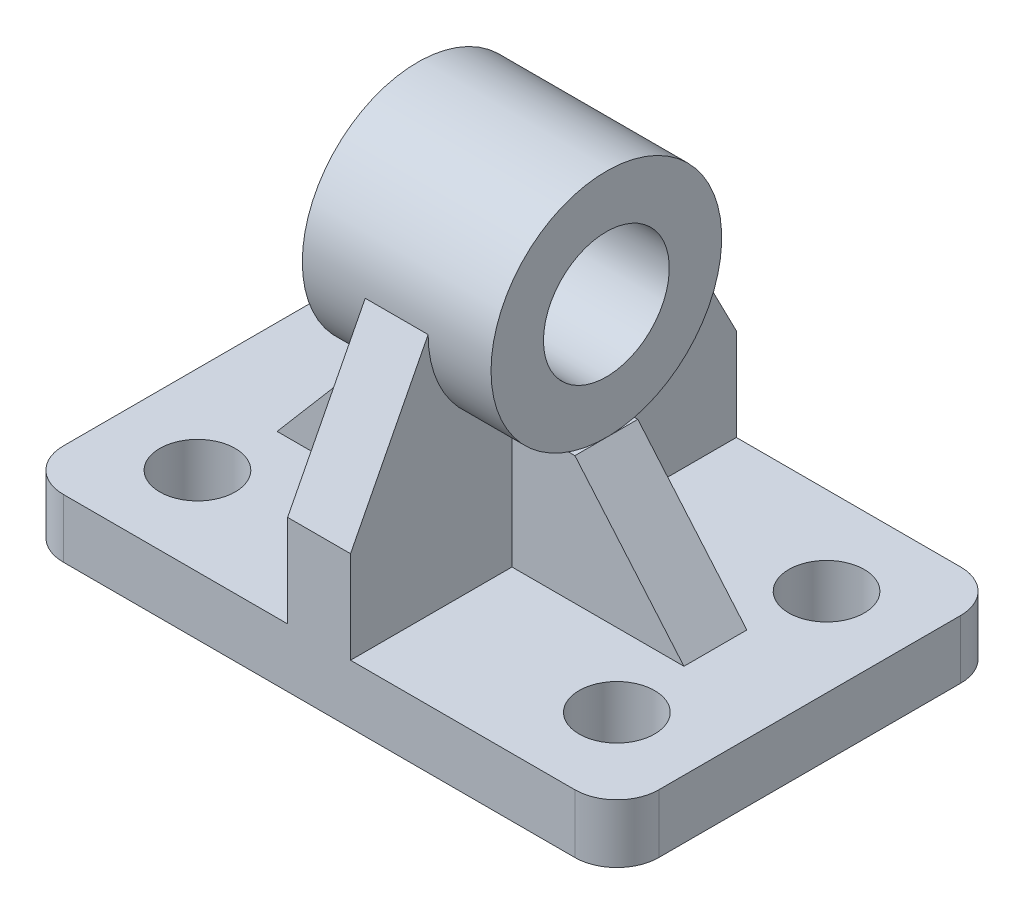
ISO-10303-21;
HEADER;
FILE_DESCRIPTION(('STEP AP214'),'2;1');
FILE_NAME('part.step','',(''),(''),'','','');
FILE_SCHEMA(('AUTOMOTIVE_DESIGN { 1 0 10303 214 1 1 1 1 }'));
ENDSEC;
DATA;
#1=APPLICATION_CONTEXT('core data for automotive mechanical design processes');
#2=APPLICATION_PROTOCOL_DEFINITION('international standard','automotive_design',2000,#1);
#3=PRODUCT_CONTEXT('',#1,'mechanical');
#4=PRODUCT('Part','Part','',(#3));
#5=PRODUCT_RELATED_PRODUCT_CATEGORY('part','',(#4));
#6=PRODUCT_DEFINITION_FORMATION('','',#4);
#7=PRODUCT_DEFINITION_CONTEXT('part definition',#1,'design');
#8=PRODUCT_DEFINITION('design','',#6,#7);
#9=PRODUCT_DEFINITION_SHAPE('','',#8);
#10=(LENGTH_UNIT() NAMED_UNIT(*) SI_UNIT(.MILLI.,.METRE.));
#11=(NAMED_UNIT(*) PLANE_ANGLE_UNIT() SI_UNIT($,.RADIAN.));
#12=(NAMED_UNIT(*) SI_UNIT($,.STERADIAN.) SOLID_ANGLE_UNIT());
#13=UNCERTAINTY_MEASURE_WITH_UNIT(LENGTH_MEASURE(1.E-05),#10,'distance_accuracy_value','');
#14=(GEOMETRIC_REPRESENTATION_CONTEXT(3) GLOBAL_UNCERTAINTY_ASSIGNED_CONTEXT((#13)) GLOBAL_UNIT_ASSIGNED_CONTEXT((#10,
#11,#12)) REPRESENTATION_CONTEXT('',''));
#15=CARTESIAN_POINT('',(0.,0.,0.));
#16=DIRECTION('',(0.,0.,1.));
#17=DIRECTION('',(1.,0.,0.));
#18=AXIS2_PLACEMENT_3D('',#15,#16,#17);
#19=CARTESIAN_POINT('',(22.5,72.,0.));
#20=DIRECTION('',(-1.,0.,0.));
#21=DIRECTION('',(0.,0.,1.));
#22=AXIS2_PLACEMENT_3D('',#19,#20,#21);
#23=CYLINDRICAL_SURFACE('',#22,15.);
#24=CARTESIAN_POINT('',(22.5,72.,0.));
#25=DIRECTION('',(1.,0.,0.));
#26=DIRECTION('',(0.,0.,-1.));
#27=AXIS2_PLACEMENT_3D('',#24,#25,#26);
#28=CIRCLE('',#27,15.);
#29=CARTESIAN_POINT('',(22.5,72.,15.));
#30=VERTEX_POINT('',#29);
#31=EDGE_CURVE('E70',#30,#30,#28,.T.);
#32=CARTESIAN_POINT('',(-22.5,72.,0.));
#33=DIRECTION('',(1.,0.,0.));
#34=DIRECTION('',(0.,0.,-1.));
#35=AXIS2_PLACEMENT_3D('',#32,#33,#34);
#36=CIRCLE('',#35,15.);
#37=CARTESIAN_POINT('',(-22.5,72.,15.));
#38=VERTEX_POINT('',#37);
#39=EDGE_CURVE('E76',#38,#38,#36,.T.);
#40=CARTESIAN_POINT('',(22.5,72.,15.));
#41=CARTESIAN_POINT('',(22.03125,72.,15.));
#42=CARTESIAN_POINT('',(21.5625,72.,15.));
#43=CARTESIAN_POINT('',(20.625,72.,15.));
#44=CARTESIAN_POINT('',(20.15625,72.,15.));
#45=CARTESIAN_POINT('',(19.21875,72.,15.));
#46=CARTESIAN_POINT('',(18.75,72.,15.));
#47=CARTESIAN_POINT('',(17.8125,72.,15.));
#48=CARTESIAN_POINT('',(17.34375,72.,15.));
#49=CARTESIAN_POINT('',(16.40625,72.,15.));
#50=CARTESIAN_POINT('',(15.9375,72.,15.));
#51=CARTESIAN_POINT('',(15.,72.,15.));
#52=CARTESIAN_POINT('',(14.53125,72.,15.));
#53=CARTESIAN_POINT('',(13.59375,72.,15.));
#54=CARTESIAN_POINT('',(13.125,72.,15.));
#55=CARTESIAN_POINT('',(12.1875,72.,15.));
#56=CARTESIAN_POINT('',(11.71875,72.,15.));
#57=CARTESIAN_POINT('',(10.78125,72.,15.));
#58=CARTESIAN_POINT('',(10.3125,72.,15.));
#59=CARTESIAN_POINT('',(9.37499999999999,72.,15.));
#60=CARTESIAN_POINT('',(8.90625,72.,15.));
#61=CARTESIAN_POINT('',(7.96874999999999,72.,15.));
#62=CARTESIAN_POINT('',(7.5,72.,15.));
#63=CARTESIAN_POINT('',(6.5625,72.,15.));
#64=CARTESIAN_POINT('',(6.09375,72.,15.));
#65=CARTESIAN_POINT('',(5.15625,72.,15.));
#66=CARTESIAN_POINT('',(4.6875,72.,15.));
#67=CARTESIAN_POINT('',(3.75,72.,15.));
#68=CARTESIAN_POINT('',(3.28125,72.,15.));
#69=CARTESIAN_POINT('',(2.34375,72.,15.));
#70=CARTESIAN_POINT('',(1.875,72.,15.));
#71=CARTESIAN_POINT('',(0.937499999999997,72.,15.));
#72=CARTESIAN_POINT('',(0.468749999999997,72.,15.));
#73=CARTESIAN_POINT('',(-0.468750000000004,72.,15.));
#74=CARTESIAN_POINT('',(-0.937500000000004,72.,15.));
#75=CARTESIAN_POINT('',(-1.87500000000001,72.,15.));
#76=CARTESIAN_POINT('',(-2.34375000000001,72.,15.));
#77=CARTESIAN_POINT('',(-3.28125,72.,15.));
#78=CARTESIAN_POINT('',(-3.75,72.,15.));
#79=CARTESIAN_POINT('',(-4.6875,72.,15.));
#80=CARTESIAN_POINT('',(-5.15625,72.,15.));
#81=CARTESIAN_POINT('',(-6.09375000000001,72.,15.));
#82=CARTESIAN_POINT('',(-6.56250000000001,72.,15.));
#83=CARTESIAN_POINT('',(-7.50000000000001,72.,15.));
#84=CARTESIAN_POINT('',(-7.96875000000001,72.,15.));
#85=CARTESIAN_POINT('',(-8.90625,72.,15.));
#86=CARTESIAN_POINT('',(-9.37500000000001,72.,15.));
#87=CARTESIAN_POINT('',(-10.3125,72.,15.));
#88=CARTESIAN_POINT('',(-10.78125,72.,15.));
#89=CARTESIAN_POINT('',(-11.71875,72.,15.));
#90=CARTESIAN_POINT('',(-12.1875,72.,15.));
#91=CARTESIAN_POINT('',(-13.125,72.,15.));
#92=CARTESIAN_POINT('',(-13.59375,72.,15.));
#93=CARTESIAN_POINT('',(-14.53125,72.,15.));
#94=CARTESIAN_POINT('',(-15.,72.,15.));
#95=CARTESIAN_POINT('',(-15.9375,72.,15.));
#96=CARTESIAN_POINT('',(-16.40625,72.,15.));
#97=CARTESIAN_POINT('',(-17.34375,72.,15.));
#98=CARTESIAN_POINT('',(-17.8125,72.,15.));
#99=CARTESIAN_POINT('',(-18.75,72.,15.));
#100=CARTESIAN_POINT('',(-19.21875,72.,15.));
#101=CARTESIAN_POINT('',(-20.15625,72.,15.));
#102=CARTESIAN_POINT('',(-20.625,72.,15.));
#103=CARTESIAN_POINT('',(-21.5625,72.,15.));
#104=CARTESIAN_POINT('',(-22.03125,72.,15.));
#105=CARTESIAN_POINT('',(-22.5,72.,15.));
#106=B_SPLINE_CURVE_WITH_KNOTS('',3,(#40,#41,#42,#43,#44,#45,#46,#47,#48,#49,#50,#51,#52,#53,
#54,#55,#56,#57,#58,#59,#60,#61,#62,#63,#64,#65,#66,#67,#68,#69,#70,#71,#72,#73,#74,#75,#76,#77,
#78,#79,#80,#81,#82,#83,#84,#85,#86,#87,#88,#89,#90,#91,#92,#93,#94,#95,#96,#97,#98,#99,#100,
#101,#102,#103,#104,#105),.UNSPECIFIED.,.F.,.F.,(4,2,2,2,2,2,2,2,2,2,2,2,2,2,2,2,2,2,2,2,2,2,2,
2,2,2,2,2,2,2,2,2,4),(0.,1.40625,2.8125,4.21875,5.625,7.03125,8.4375,9.84375,11.25,12.65625,
14.0625,15.46875,16.875,18.28125,19.6875,21.09375,22.5,23.90625,25.3125,26.71875,28.125,
29.53125,30.9375,32.34375,33.75,35.15625,36.5625,37.96875,39.375,40.78125,42.1875,43.59375,45.),.UNSPECIFIED.);
#107=EDGE_CURVE('BSEAM63',#30,#38,#106,.T.);
#108=ORIENTED_EDGE('',*,*,#31,.T.);
#109=ORIENTED_EDGE('',*,*,#39,.F.);
#110=ORIENTED_EDGE('',*,*,#107,.T.);
#111=ORIENTED_EDGE('',*,*,#107,.F.);
#112=EDGE_LOOP('',(#108,#110,#109,#111));
#113=FACE_BOUND('',#112,.T.);
#114=ADVANCED_FACE('F63',(#113),#23,.F.);
#115=CARTESIAN_POINT('',(22.5,72.,0.));
#116=DIRECTION('',(-1.,0.,0.));
#117=DIRECTION('',(0.,0.,1.));
#118=AXIS2_PLACEMENT_3D('',#115,#116,#117);
#119=CYLINDRICAL_SURFACE('',#118,27.5);
#120=CARTESIAN_POINT('',(22.5,72.,0.));
#121=DIRECTION('',(1.,0.,0.));
#122=DIRECTION('',(0.,0.,-1.));
#123=AXIS2_PLACEMENT_3D('',#120,#121,#122);
#124=CIRCLE('',#123,27.5);
#125=CARTESIAN_POINT('',(22.5,72.,27.5));
#126=VERTEX_POINT('',#125);
#127=EDGE_CURVE('E12',#126,#126,#124,.T.);
#128=CARTESIAN_POINT('',(-22.5,72.,0.));
#129=DIRECTION('',(1.,0.,0.));
#130=DIRECTION('',(0.,0.,-1.));
#131=AXIS2_PLACEMENT_3D('',#128,#129,#130);
#132=CIRCLE('',#131,27.5);
#133=CARTESIAN_POINT('',(-22.5,72.,27.5));
#134=VERTEX_POINT('',#133);
#135=EDGE_CURVE('E66',#134,#134,#132,.T.);
#136=CARTESIAN_POINT('',(22.5,72.,27.5));
#137=CARTESIAN_POINT('',(22.03125,72.,27.5));
#138=CARTESIAN_POINT('',(21.5625,72.,27.5));
#139=CARTESIAN_POINT('',(20.625,72.,27.5));
#140=CARTESIAN_POINT('',(20.15625,72.,27.5));
#141=CARTESIAN_POINT('',(19.21875,72.,27.5));
#142=CARTESIAN_POINT('',(18.75,72.,27.5));
#143=CARTESIAN_POINT('',(17.8125,72.,27.5));
#144=CARTESIAN_POINT('',(17.34375,72.,27.5));
#145=CARTESIAN_POINT('',(16.40625,72.,27.5));
#146=CARTESIAN_POINT('',(15.9375,72.,27.5));
#147=CARTESIAN_POINT('',(15.,72.,27.5));
#148=CARTESIAN_POINT('',(14.53125,72.,27.5));
#149=CARTESIAN_POINT('',(13.59375,72.,27.5));
#150=CARTESIAN_POINT('',(13.125,72.,27.5));
#151=CARTESIAN_POINT('',(12.1875,72.,27.5));
#152=CARTESIAN_POINT('',(11.71875,72.,27.5));
#153=CARTESIAN_POINT('',(10.78125,72.,27.5));
#154=CARTESIAN_POINT('',(10.3125,72.,27.5));
#155=CARTESIAN_POINT('',(9.37499999999999,72.,27.5));
#156=CARTESIAN_POINT('',(8.90625,72.,27.5));
#157=CARTESIAN_POINT('',(7.96874999999999,72.,27.5));
#158=CARTESIAN_POINT('',(7.5,72.,27.5));
#159=CARTESIAN_POINT('',(6.5625,72.,27.5));
#160=CARTESIAN_POINT('',(6.09374999999999,72.,27.5));
#161=CARTESIAN_POINT('',(5.15624999999999,72.,27.5));
#162=CARTESIAN_POINT('',(4.68749999999999,72.,27.5));
#163=CARTESIAN_POINT('',(3.74999999999999,72.,27.5));
#164=CARTESIAN_POINT('',(3.28124999999999,72.,27.5));
#165=CARTESIAN_POINT('',(2.34375,72.,27.5));
#166=CARTESIAN_POINT('',(1.87499999999999,72.,27.5));
#167=CARTESIAN_POINT('',(0.937499999999994,72.,27.5));
#168=CARTESIAN_POINT('',(0.468749999999993,72.,27.5));
#169=CARTESIAN_POINT('',(-0.468750000000007,72.,27.5));
#170=CARTESIAN_POINT('',(-0.937500000000008,72.,27.5));
#171=CARTESIAN_POINT('',(-1.87500000000001,72.,27.5));
#172=CARTESIAN_POINT('',(-2.34375000000001,72.,27.5));
#173=CARTESIAN_POINT('',(-3.28125000000001,72.,27.5));
#174=CARTESIAN_POINT('',(-3.75000000000001,72.,27.5));
#175=CARTESIAN_POINT('',(-4.68750000000001,72.,27.5));
#176=CARTESIAN_POINT('',(-5.15625000000001,72.,27.5));
#177=CARTESIAN_POINT('',(-6.09375000000001,72.,27.5));
#178=CARTESIAN_POINT('',(-6.56250000000001,72.,27.5));
#179=CARTESIAN_POINT('',(-7.50000000000001,72.,27.5));
#180=CARTESIAN_POINT('',(-7.96875000000001,72.,27.5));
#181=CARTESIAN_POINT('',(-8.90625000000001,72.,27.5));
#182=CARTESIAN_POINT('',(-9.37500000000001,72.,27.5));
#183=CARTESIAN_POINT('',(-10.3125,72.,27.5));
#184=CARTESIAN_POINT('',(-10.78125,72.,27.5));
#185=CARTESIAN_POINT('',(-11.71875,72.,27.5));
#186=CARTESIAN_POINT('',(-12.1875,72.,27.5));
#187=CARTESIAN_POINT('',(-13.125,72.,27.5));
#188=CARTESIAN_POINT('',(-13.59375,72.,27.5));
#189=CARTESIAN_POINT('',(-14.53125,72.,27.5));
#190=CARTESIAN_POINT('',(-15.,72.,27.5));
#191=CARTESIAN_POINT('',(-15.9375,72.,27.5));
#192=CARTESIAN_POINT('',(-16.40625,72.,27.5));
#193=CARTESIAN_POINT('',(-17.34375,72.,27.5));
#194=CARTESIAN_POINT('',(-17.8125,72.,27.5));
#195=CARTESIAN_POINT('',(-18.75,72.,27.5));
#196=CARTESIAN_POINT('',(-19.21875,72.,27.5));
#197=CARTESIAN_POINT('',(-20.15625,72.,27.5));
#198=CARTESIAN_POINT('',(-20.625,72.,27.5));
#199=CARTESIAN_POINT('',(-21.5625,72.,27.5));
#200=CARTESIAN_POINT('',(-22.03125,72.,27.5));
#201=CARTESIAN_POINT('',(-22.5,72.,27.5));
#202=B_SPLINE_CURVE_WITH_KNOTS('',3,(#136,#137,#138,#139,#140,#141,#142,#143,#144,#145,#146,
#147,#148,#149,#150,#151,#152,#153,#154,#155,#156,#157,#158,#159,#160,#161,#162,#163,#164,#165,
#166,#167,#168,#169,#170,#171,#172,#173,#174,#175,#176,#177,#178,#179,#180,#181,#182,#183,#184,
#185,#186,#187,#188,#189,#190,#191,#192,#193,#194,#195,#196,#197,#198,#199,#200,#201),
.UNSPECIFIED.,.F.,.F.,(4,2,2,2,2,2,2,2,2,2,2,2,2,2,2,2,2,2,2,2,2,2,2,2,2,2,2,2,2,2,2,2,4),(0.,
1.40625,2.8125,4.21875,5.625,7.03125,8.4375,9.84375,11.25,12.65625,14.0625,15.46875,16.875,
18.28125,19.6875,21.09375,22.5,23.90625,25.3125,26.71875,28.125,29.53125,30.9375,32.34375,33.75,
35.15625,36.5625,37.96875,39.375,40.78125,42.1875,43.59375,45.),.UNSPECIFIED.);
#203=EDGE_CURVE('BSEAM83',#126,#134,#202,.T.);
#204=ORIENTED_EDGE('',*,*,#127,.F.);
#205=ORIENTED_EDGE('',*,*,#135,.T.);
#206=ORIENTED_EDGE('',*,*,#203,.T.);
#207=ORIENTED_EDGE('',*,*,#203,.F.);
#208=EDGE_LOOP('',(#204,#206,#205,#207));
#209=FACE_BOUND('',#208,.T.);
#210=ADVANCED_FACE('F83',(#209),#119,.T.);
#211=CARTESIAN_POINT('',(22.5,0.,0.));
#212=DIRECTION('',(1.,0.,0.));
#213=DIRECTION('',(0.,0.,-1.));
#214=AXIS2_PLACEMENT_3D('',#211,#212,#213);
#215=PLANE('',#214);
#216=ORIENTED_EDGE('',*,*,#31,.F.);
#217=EDGE_LOOP('',(#216));
#218=FACE_BOUND('',#217,.T.);
#219=ORIENTED_EDGE('',*,*,#127,.T.);
#220=EDGE_LOOP('',(#219));
#221=FACE_BOUND('',#220,.T.);
#222=ADVANCED_FACE('F87',(#218,#221),#215,.T.);
#223=CARTESIAN_POINT('',(-22.5,0.,0.));
#224=DIRECTION('',(1.,0.,0.));
#225=DIRECTION('',(0.,0.,-1.));
#226=AXIS2_PLACEMENT_3D('',#223,#224,#225);
#227=PLANE('',#226);
#228=ORIENTED_EDGE('',*,*,#39,.T.);
#229=EDGE_LOOP('',(#228));
#230=FACE_BOUND('',#229,.T.);
#231=ORIENTED_EDGE('',*,*,#135,.F.);
#232=EDGE_LOOP('',(#231));
#233=FACE_BOUND('',#232,.T.);
#234=ADVANCED_FACE('F85',(#230,#233),#227,.F.);
#235=CLOSED_SHELL('',(#114,#210,#222,#234));
#236=MANIFOLD_SOLID_BREP('B2',#235);
#237=CARTESIAN_POINT('',(0.,44.5,0.));
#238=DIRECTION('',(0.,1.,0.));
#239=DIRECTION('',(0.,0.,1.));
#240=AXIS2_PLACEMENT_3D('',#237,#238,#239);
#241=PLANE('',#240);
#242=DIRECTION('',(-1.,0.,0.));
#243=VECTOR('',#242,1.);
#244=CARTESIAN_POINT('',(0.,44.5,7.5));
#245=LINE('',#244,#243);
#246=CARTESIAN_POINT('',(-7.5,44.5,7.5));
#247=VERTEX_POINT('',#246);
#248=CARTESIAN_POINT('',(-22.5,44.5,7.5));
#249=VERTEX_POINT('',#248);
#250=EDGE_CURVE('E371',#247,#249,#245,.T.);
#251=ORIENTED_EDGE('',*,*,#250,.F.);
#252=DIRECTION('',(0.,0.,-1.));
#253=VECTOR('',#252,1.);
#254=CARTESIAN_POINT('',(-7.5,44.5,0.));
#255=LINE('',#254,#253);
#256=CARTESIAN_POINT('',(-7.5,44.5,0.));
#257=VERTEX_POINT('',#256);
#258=EDGE_CURVE('E157',#247,#257,#255,.T.);
#259=ORIENTED_EDGE('',*,*,#258,.T.);
#260=CARTESIAN_POINT('',(-7.5,44.5,-7.5));
#261=VERTEX_POINT('',#260);
#262=EDGE_CURVE('E304',#257,#261,#255,.T.);
#263=ORIENTED_EDGE('',*,*,#262,.T.);
#264=DIRECTION('',(-1.,0.,0.));
#265=VECTOR('',#264,1.);
#266=CARTESIAN_POINT('',(0.,44.5,-7.5));
#267=LINE('',#266,#265);
#268=CARTESIAN_POINT('',(-22.5,44.5,-7.5));
#269=VERTEX_POINT('',#268);
#270=EDGE_CURVE('E359',#261,#269,#267,.T.);
#271=ORIENTED_EDGE('',*,*,#270,.T.);
#272=DIRECTION('',(0.,0.,1.));
#273=VECTOR('',#272,1.);
#274=CARTESIAN_POINT('',(-22.5,44.5,-46.001));
#275=LINE('',#274,#273);
#276=EDGE_CURVE('E355',#269,#249,#275,.T.);
#277=ORIENTED_EDGE('',*,*,#276,.T.);
#278=EDGE_LOOP('',(#251,#259,#263,#271,#277));
#279=FACE_BOUND('',#278,.T.);
#280=ADVANCED_FACE('F133',(#279),#241,.T.);
#281=CARTESIAN_POINT('',(0.,44.5,7.5));
#282=DIRECTION('',(0.,0.,1.));
#283=DIRECTION('',(1.,0.,0.));
#284=AXIS2_PLACEMENT_3D('',#281,#282,#283);
#285=PLANE('',#284);
#286=DIRECTION('',(0.,-1.,0.));
#287=VECTOR('',#286,1.);
#288=CARTESIAN_POINT('',(-7.5,36.,7.5));
#289=LINE('',#288,#287);
#290=CARTESIAN_POINT('',(-7.5,14.,7.5));
#291=VERTEX_POINT('',#290);
#292=EDGE_CURVE('E487',#247,#291,#289,.T.);
#293=ORIENTED_EDGE('',*,*,#292,.F.);
#294=ORIENTED_EDGE('',*,*,#250,.T.);
#295=DIRECTION('',(0.648734176013878,0.761015091093203,0.));
#296=VECTOR('',#295,1.);
#297=CARTESIAN_POINT('',(-22.5,44.5,7.5));
#298=LINE('',#297,#296);
#299=CARTESIAN_POINT('',(-48.5,14.,7.5));
#300=VERTEX_POINT('',#299);
#301=EDGE_CURVE('E350',#300,#249,#298,.T.);
#302=ORIENTED_EDGE('',*,*,#301,.F.);
#303=DIRECTION('',(-1.,0.,0.));
#304=VECTOR('',#303,1.);
#305=CARTESIAN_POINT('',(0.,14.,7.5));
#306=LINE('',#305,#304);
#307=EDGE_CURVE('E511',#291,#300,#306,.T.);
#308=ORIENTED_EDGE('',*,*,#307,.F.);
#309=EDGE_LOOP('',(#293,#294,#302,#308));
#310=FACE_BOUND('',#309,.T.);
#311=ADVANCED_FACE('F628',(#310),#285,.T.);
#312=CARTESIAN_POINT('',(0.,44.5,-7.5));
#313=DIRECTION('',(0.,0.,1.));
#314=DIRECTION('',(1.,0.,0.));
#315=AXIS2_PLACEMENT_3D('',#312,#313,#314);
#316=PLANE('',#315);
#317=ORIENTED_EDGE('',*,*,#270,.F.);
#318=DIRECTION('',(0.,-1.,0.));
#319=VECTOR('',#318,1.);
#320=CARTESIAN_POINT('',(-7.5,36.,-7.5));
#321=LINE('',#320,#319);
#322=CARTESIAN_POINT('',(-7.5,14.,-7.5));
#323=VERTEX_POINT('',#322);
#324=EDGE_CURVE('E387',#261,#323,#321,.T.);
#325=ORIENTED_EDGE('',*,*,#324,.T.);
#326=DIRECTION('',(-1.,0.,0.));
#327=VECTOR('',#326,1.);
#328=CARTESIAN_POINT('',(0.,14.,-7.5));
#329=LINE('',#328,#327);
#330=CARTESIAN_POINT('',(-48.5,14.,-7.50000000000001));
#331=VERTEX_POINT('',#330);
#332=EDGE_CURVE('E518',#323,#331,#329,.T.);
#333=ORIENTED_EDGE('',*,*,#332,.T.);
#334=DIRECTION('',(-0.648734176013878,-0.761015091093203,0.));
#335=VECTOR('',#334,1.);
#336=CARTESIAN_POINT('',(-22.5,44.5,-7.5));
#337=LINE('',#336,#335);
#338=EDGE_CURVE('E347',#269,#331,#337,.T.);
#339=ORIENTED_EDGE('',*,*,#338,.F.);
#340=EDGE_LOOP('',(#317,#325,#333,#339));
#341=FACE_BOUND('',#340,.T.);
#342=ADVANCED_FACE('F639',(#341),#316,.F.);
#343=CARTESIAN_POINT('',(-61.,14.,36.));
#344=DIRECTION('',(0.,-1.,0.));
#345=DIRECTION('',(0.,0.,-1.));
#346=AXIS2_PLACEMENT_3D('',#343,#344,#345);
#347=CYLINDRICAL_SURFACE('',#346,10.);
#348=CARTESIAN_POINT('',(-61.,0.,36.));
#349=DIRECTION('',(0.,1.,0.));
#350=DIRECTION('',(0.,0.,1.));
#351=AXIS2_PLACEMENT_3D('',#348,#349,#350);
#352=CIRCLE('',#351,10.);
#353=CARTESIAN_POINT('',(-61.,0.,46.));
#354=VERTEX_POINT('',#353);
#355=CARTESIAN_POINT('',(-71.,0.,36.));
#356=VERTEX_POINT('',#355);
#357=EDGE_CURVE('E543',#354,#356,#352,.F.);
#358=ORIENTED_EDGE('',*,*,#357,.F.);
#359=DIRECTION('',(0.,-1.,0.));
#360=VECTOR('',#359,1.);
#361=CARTESIAN_POINT('',(-61.,14.,46.));
#362=LINE('',#361,#360);
#363=CARTESIAN_POINT('',(-61.,14.,46.));
#364=VERTEX_POINT('',#363);
#365=EDGE_CURVE('E61',#364,#354,#362,.T.);
#366=ORIENTED_EDGE('',*,*,#365,.F.);
#367=CARTESIAN_POINT('',(-61.,14.,36.));
#368=DIRECTION('',(0.,1.,0.));
#369=DIRECTION('',(0.,0.,1.));
#370=AXIS2_PLACEMENT_3D('',#367,#368,#369);
#371=CIRCLE('',#370,10.);
#372=CARTESIAN_POINT('',(-71.,14.,36.));
#373=VERTEX_POINT('',#372);
#374=EDGE_CURVE('E500',#364,#373,#371,.F.);
#375=ORIENTED_EDGE('',*,*,#374,.T.);
#376=DIRECTION('',(0.,-1.,0.));
#377=VECTOR('',#376,1.);
#378=CARTESIAN_POINT('',(-71.,14.,36.));
#379=LINE('',#378,#377);
#380=EDGE_CURVE('E535',#373,#356,#379,.T.);
#381=ORIENTED_EDGE('',*,*,#380,.T.);
#382=EDGE_LOOP('',(#358,#366,#375,#381));
#383=FACE_BOUND('',#382,.T.);
#384=ADVANCED_FACE('F621',(#383),#347,.T.);
#385=CARTESIAN_POINT('',(0.,14.,46.));
#386=DIRECTION('',(0.,0.,1.));
#387=DIRECTION('',(1.,0.,0.));
#388=AXIS2_PLACEMENT_3D('',#385,#386,#387);
#389=PLANE('',#388);
#390=DIRECTION('',(-1.,0.,0.));
#391=VECTOR('',#390,1.);
#392=CARTESIAN_POINT('',(0.,0.,46.));
#393=LINE('',#392,#391);
#394=CARTESIAN_POINT('',(61.0000000000002,0.,46.));
#395=VERTEX_POINT('',#394);
#396=EDGE_CURVE('E547',#395,#354,#393,.T.);
#397=ORIENTED_EDGE('',*,*,#396,.F.);
#398=DIRECTION('',(0.,-1.,0.));
#399=VECTOR('',#398,1.);
#400=CARTESIAN_POINT('',(61.0000000000002,14.,46.));
#401=LINE('',#400,#399);
#402=CARTESIAN_POINT('',(61.0000000000002,14.,46.));
#403=VERTEX_POINT('',#402);
#404=EDGE_CURVE('E442',#403,#395,#401,.T.);
#405=ORIENTED_EDGE('',*,*,#404,.F.);
#406=DIRECTION('',(-1.,0.,0.));
#407=VECTOR('',#406,1.);
#408=CARTESIAN_POINT('',(0.,14.,46.));
#409=LINE('',#408,#407);
#410=CARTESIAN_POINT('',(7.50000000000001,14.,46.));
#411=VERTEX_POINT('',#410);
#412=EDGE_CURVE('E434',#403,#411,#409,.T.);
#413=ORIENTED_EDGE('',*,*,#412,.T.);
#414=DIRECTION('',(0.,-1.,0.));
#415=VECTOR('',#414,1.);
#416=CARTESIAN_POINT('',(7.50000000000001,36.,46.));
#417=LINE('',#416,#415);
#418=CARTESIAN_POINT('',(7.50000000000001,36.,46.));
#419=VERTEX_POINT('',#418);
#420=EDGE_CURVE('E480',#419,#411,#417,.T.);
#421=ORIENTED_EDGE('',*,*,#420,.F.);
#422=DIRECTION('',(-1.,0.,0.));
#423=VECTOR('',#422,1.);
#424=CARTESIAN_POINT('',(0.,36.,46.));
#425=LINE('',#424,#423);
#426=CARTESIAN_POINT('',(-7.5,36.,46.));
#427=VERTEX_POINT('',#426);
#428=EDGE_CURVE('E312',#419,#427,#425,.T.);
#429=ORIENTED_EDGE('',*,*,#428,.T.);
#430=DIRECTION('',(0.,-1.,0.));
#431=VECTOR('',#430,1.);
#432=CARTESIAN_POINT('',(-7.5,36.,46.));
#433=LINE('',#432,#431);
#434=CARTESIAN_POINT('',(-7.5,14.,46.));
#435=VERTEX_POINT('',#434);
#436=EDGE_CURVE('E483',#427,#435,#433,.T.);
#437=ORIENTED_EDGE('',*,*,#436,.T.);
#438=DIRECTION('',(-1.,0.,0.));
#439=VECTOR('',#438,1.);
#440=CARTESIAN_POINT('',(0.,14.,46.));
#441=LINE('',#440,#439);
#442=EDGE_CURVE('E504',#435,#364,#441,.T.);
#443=ORIENTED_EDGE('',*,*,#442,.T.);
#444=ORIENTED_EDGE('',*,*,#365,.T.);
#445=EDGE_LOOP('',(#397,#405,#413,#421,#429,#437,#443,#444));
#446=FACE_BOUND('',#445,.T.);
#447=ADVANCED_FACE('F618',(#446),#389,.T.);
#448=CARTESIAN_POINT('',(0.,14.,-46.));
#449=DIRECTION('',(0.,0.,1.));
#450=DIRECTION('',(1.,0.,0.));
#451=AXIS2_PLACEMENT_3D('',#448,#449,#450);
#452=PLANE('',#451);
#453=DIRECTION('',(-1.,0.,0.));
#454=VECTOR('',#453,1.);
#455=CARTESIAN_POINT('',(0.,0.,-46.));
#456=LINE('',#455,#454);
#457=CARTESIAN_POINT('',(61.,0.,-46.));
#458=VERTEX_POINT('',#457);
#459=CARTESIAN_POINT('',(-61.,0.,-46.));
#460=VERTEX_POINT('',#459);
#461=EDGE_CURVE('E551',#458,#460,#456,.T.);
#462=ORIENTED_EDGE('',*,*,#461,.T.);
#463=DIRECTION('',(0.,-1.,0.));
#464=VECTOR('',#463,1.);
#465=CARTESIAN_POINT('',(-61.,14.,-46.));
#466=LINE('',#465,#464);
#467=CARTESIAN_POINT('',(-61.,14.,-46.));
#468=VERTEX_POINT('',#467);
#469=EDGE_CURVE('E142',#468,#460,#466,.T.);
#470=ORIENTED_EDGE('',*,*,#469,.F.);
#471=DIRECTION('',(-1.,0.,0.));
#472=VECTOR('',#471,1.);
#473=CARTESIAN_POINT('',(0.,14.,-46.));
#474=LINE('',#473,#472);
#475=CARTESIAN_POINT('',(-7.5,14.,-46.));
#476=VERTEX_POINT('',#475);
#477=EDGE_CURVE('E525',#476,#468,#474,.T.);
#478=ORIENTED_EDGE('',*,*,#477,.F.);
#479=DIRECTION('',(0.,-1.,0.));
#480=VECTOR('',#479,1.);
#481=CARTESIAN_POINT('',(-7.5,36.,-46.));
#482=LINE('',#481,#480);
#483=CARTESIAN_POINT('',(-7.5,36.,-46.));
#484=VERTEX_POINT('',#483);
#485=EDGE_CURVE('E391',#484,#476,#482,.T.);
#486=ORIENTED_EDGE('',*,*,#485,.F.);
#487=DIRECTION('',(-1.,0.,0.));
#488=VECTOR('',#487,1.);
#489=CARTESIAN_POINT('',(0.,36.,-46.));
#490=LINE('',#489,#488);
#491=CARTESIAN_POINT('',(7.5,36.,-46.));
#492=VERTEX_POINT('',#491);
#493=EDGE_CURVE('E376',#492,#484,#490,.T.);
#494=ORIENTED_EDGE('',*,*,#493,.F.);
#495=DIRECTION('',(0.,-1.,0.));
#496=VECTOR('',#495,1.);
#497=CARTESIAN_POINT('',(7.5,36.,-46.));
#498=LINE('',#497,#496);
#499=CARTESIAN_POINT('',(7.5,14.,-46.));
#500=VERTEX_POINT('',#499);
#501=EDGE_CURVE('E380',#492,#500,#498,.T.);
#502=ORIENTED_EDGE('',*,*,#501,.T.);
#503=DIRECTION('',(-1.,0.,0.));
#504=VECTOR('',#503,1.);
#505=CARTESIAN_POINT('',(0.,14.,-46.));
#506=LINE('',#505,#504);
#507=CARTESIAN_POINT('',(61.,14.,-46.));
#508=VERTEX_POINT('',#507);
#509=EDGE_CURVE('E412',#508,#500,#506,.T.);
#510=ORIENTED_EDGE('',*,*,#509,.F.);
#511=DIRECTION('',(0.,-1.,0.));
#512=VECTOR('',#511,1.);
#513=CARTESIAN_POINT('',(61.,14.,-46.));
#514=LINE('',#513,#512);
#515=EDGE_CURVE('E464',#508,#458,#514,.T.);
#516=ORIENTED_EDGE('',*,*,#515,.T.);
#517=EDGE_LOOP('',(#462,#470,#478,#486,#494,#502,#510,#516));
#518=FACE_BOUND('',#517,.T.);
#519=ADVANCED_FACE('F574',(#518),#452,.F.);
#520=CARTESIAN_POINT('',(-61.,14.,-36.));
#521=DIRECTION('',(0.,-1.,0.));
#522=DIRECTION('',(0.,0.,-1.));
#523=AXIS2_PLACEMENT_3D('',#520,#521,#522);
#524=CYLINDRICAL_SURFACE('',#523,10.);
#525=CARTESIAN_POINT('',(-61.,0.,-36.));
#526=DIRECTION('',(0.,1.,0.));
#527=DIRECTION('',(0.,0.,1.));
#528=AXIS2_PLACEMENT_3D('',#525,#526,#527);
#529=CIRCLE('',#528,10.);
#530=CARTESIAN_POINT('',(-71.,0.,-36.));
#531=VERTEX_POINT('',#530);
#532=EDGE_CURVE('E555',#531,#460,#529,.F.);
#533=ORIENTED_EDGE('',*,*,#532,.F.);
#534=DIRECTION('',(0.,-1.,0.));
#535=VECTOR('',#534,1.);
#536=CARTESIAN_POINT('',(-71.,14.,-36.));
#537=LINE('',#536,#535);
#538=CARTESIAN_POINT('',(-71.,14.,-36.));
#539=VERTEX_POINT('',#538);
#540=EDGE_CURVE('E564',#539,#531,#537,.T.);
#541=ORIENTED_EDGE('',*,*,#540,.F.);
#542=CARTESIAN_POINT('',(-61.,14.,-36.));
#543=DIRECTION('',(0.,1.,0.));
#544=DIRECTION('',(0.,0.,1.));
#545=AXIS2_PLACEMENT_3D('',#542,#543,#544);
#546=CIRCLE('',#545,10.);
#547=EDGE_CURVE('E528',#539,#468,#546,.F.);
#548=ORIENTED_EDGE('',*,*,#547,.T.);
#549=ORIENTED_EDGE('',*,*,#469,.T.);
#550=EDGE_LOOP('',(#533,#541,#548,#549));
#551=FACE_BOUND('',#550,.T.);
#552=ADVANCED_FACE('F570',(#551),#524,.T.);
#553=CARTESIAN_POINT('',(-50.,14.,-25.));
#554=DIRECTION('',(0.,-1.,0.));
#555=DIRECTION('',(0.,0.,-1.));
#556=AXIS2_PLACEMENT_3D('',#553,#554,#555);
#557=CYLINDRICAL_SURFACE('',#556,9.);
#558=CARTESIAN_POINT('',(-50.,14.,-25.));
#559=DIRECTION('',(0.,1.,0.));
#560=DIRECTION('',(0.,0.,1.));
#561=AXIS2_PLACEMENT_3D('',#558,#559,#560);
#562=CIRCLE('',#561,9.);
#563=CARTESIAN_POINT('',(-50.,14.,-16.));
#564=VERTEX_POINT('',#563);
#565=EDGE_CURVE('E495',#564,#564,#562,.T.);
#566=ORIENTED_EDGE('',*,*,#565,.T.);
#567=EDGE_LOOP('',(#566));
#568=FACE_BOUND('',#567,.T.);
#569=CARTESIAN_POINT('',(-50.,0.,-25.));
#570=DIRECTION('',(0.,1.,0.));
#571=DIRECTION('',(0.,0.,1.));
#572=AXIS2_PLACEMENT_3D('',#569,#570,#571);
#573=CIRCLE('',#572,9.);
#574=CARTESIAN_POINT('',(-50.,0.,-16.));
#575=VERTEX_POINT('',#574);
#576=EDGE_CURVE('E539',#575,#575,#573,.T.);
#577=ORIENTED_EDGE('',*,*,#576,.F.);
#578=EDGE_LOOP('',(#577));
#579=FACE_BOUND('',#578,.T.);
#580=ADVANCED_FACE('F693',(#568,#579),#557,.F.);
#581=CARTESIAN_POINT('',(-50.,14.,25.));
#582=DIRECTION('',(0.,-1.,0.));
#583=DIRECTION('',(0.,0.,-1.));
#584=AXIS2_PLACEMENT_3D('',#581,#582,#583);
#585=CYLINDRICAL_SURFACE('',#584,9.);
#586=CARTESIAN_POINT('',(-50.,14.,25.));
#587=DIRECTION('',(0.,1.,0.));
#588=DIRECTION('',(0.,0.,1.));
#589=AXIS2_PLACEMENT_3D('',#586,#587,#588);
#590=CIRCLE('',#589,9.);
#591=CARTESIAN_POINT('',(-50.,14.,34.));
#592=VERTEX_POINT('',#591);
#593=EDGE_CURVE('E491',#592,#592,#590,.T.);
#594=ORIENTED_EDGE('',*,*,#593,.T.);
#595=EDGE_LOOP('',(#594));
#596=FACE_BOUND('',#595,.T.);
#597=CARTESIAN_POINT('',(-50.,0.,25.));
#598=DIRECTION('',(0.,1.,0.));
#599=DIRECTION('',(0.,0.,1.));
#600=AXIS2_PLACEMENT_3D('',#597,#598,#599);
#601=CIRCLE('',#600,9.);
#602=CARTESIAN_POINT('',(-50.,0.,34.));
#603=VERTEX_POINT('',#602);
#604=EDGE_CURVE('E490',#603,#603,#601,.T.);
#605=ORIENTED_EDGE('',*,*,#604,.F.);
#606=EDGE_LOOP('',(#605));
#607=FACE_BOUND('',#606,.T.);
#608=ADVANCED_FACE('F135',(#596,#607),#585,.F.);
#609=CARTESIAN_POINT('',(-71.,14.,0.));
#610=DIRECTION('',(1.,0.,0.));
#611=DIRECTION('',(0.,0.,-1.));
#612=AXIS2_PLACEMENT_3D('',#609,#610,#611);
#613=PLANE('',#612);
#614=DIRECTION('',(0.,0.,1.));
#615=VECTOR('',#614,1.);
#616=CARTESIAN_POINT('',(-71.,0.,0.));
#617=LINE('',#616,#615);
#618=EDGE_CURVE('E496',#531,#356,#617,.T.);
#619=ORIENTED_EDGE('',*,*,#618,.T.);
#620=ORIENTED_EDGE('',*,*,#380,.F.);
#621=DIRECTION('',(0.,0.,1.));
#622=VECTOR('',#621,1.);
#623=CARTESIAN_POINT('',(-71.,14.,0.));
#624=LINE('',#623,#622);
#625=EDGE_CURVE('E532',#539,#373,#624,.T.);
#626=ORIENTED_EDGE('',*,*,#625,.F.);
#627=ORIENTED_EDGE('',*,*,#540,.T.);
#628=EDGE_LOOP('',(#619,#620,#626,#627));
#629=FACE_BOUND('',#628,.T.);
#630=ADVANCED_FACE('F584',(#629),#613,.F.);
#631=CARTESIAN_POINT('',(0.,14.,0.));
#632=DIRECTION('',(0.,1.,0.));
#633=DIRECTION('',(0.,0.,1.));
#634=AXIS2_PLACEMENT_3D('',#631,#632,#633);
#635=PLANE('',#634);
#636=ORIENTED_EDGE('',*,*,#593,.F.);
#637=EDGE_LOOP('',(#636));
#638=FACE_BOUND('',#637,.T.);
#639=ORIENTED_EDGE('',*,*,#565,.F.);
#640=EDGE_LOOP('',(#639));
#641=FACE_BOUND('',#640,.T.);
#642=ORIENTED_EDGE('',*,*,#374,.F.);
#643=ORIENTED_EDGE('',*,*,#442,.F.);
#644=DIRECTION('',(0.,0.,1.));
#645=VECTOR('',#644,1.);
#646=CARTESIAN_POINT('',(-7.5,14.,0.));
#647=LINE('',#646,#645);
#648=EDGE_CURVE('E508',#291,#435,#647,.T.);
#649=ORIENTED_EDGE('',*,*,#648,.F.);
#650=ORIENTED_EDGE('',*,*,#307,.T.);
#651=DIRECTION('',(0.,0.,1.));
#652=VECTOR('',#651,1.);
#653=CARTESIAN_POINT('',(-48.5,14.,0.));
#654=LINE('',#653,#652);
#655=EDGE_CURVE('E515',#331,#300,#654,.T.);
#656=ORIENTED_EDGE('',*,*,#655,.F.);
#657=ORIENTED_EDGE('',*,*,#332,.F.);
#658=DIRECTION('',(0.,0.,1.));
#659=VECTOR('',#658,1.);
#660=CARTESIAN_POINT('',(-7.5,14.,0.));
#661=LINE('',#660,#659);
#662=EDGE_CURVE('E522',#476,#323,#661,.T.);
#663=ORIENTED_EDGE('',*,*,#662,.F.);
#664=ORIENTED_EDGE('',*,*,#477,.T.);
#665=ORIENTED_EDGE('',*,*,#547,.F.);
#666=ORIENTED_EDGE('',*,*,#625,.T.);
#667=EDGE_LOOP('',(#642,#643,#649,#650,#656,#657,#663,#664,#665,#666));
#668=FACE_BOUND('',#667,.T.);
#669=ADVANCED_FACE('F588',(#638,#641,#668),#635,.T.);
#670=CARTESIAN_POINT('',(0.,0.,0.));
#671=DIRECTION('',(0.,1.,0.));
#672=DIRECTION('',(0.,0.,1.));
#673=AXIS2_PLACEMENT_3D('',#670,#671,#672);
#674=PLANE('',#673);
#675=ORIENTED_EDGE('',*,*,#604,.T.);
#676=EDGE_LOOP('',(#675));
#677=FACE_BOUND('',#676,.T.);
#678=ORIENTED_EDGE('',*,*,#576,.T.);
#679=EDGE_LOOP('',(#678));
#680=FACE_BOUND('',#679,.T.);
#681=ORIENTED_EDGE('',*,*,#357,.T.);
#682=ORIENTED_EDGE('',*,*,#618,.F.);
#683=ORIENTED_EDGE('',*,*,#532,.T.);
#684=ORIENTED_EDGE('',*,*,#461,.F.);
#685=CARTESIAN_POINT('',(61.,0.,-36.));
#686=DIRECTION('',(0.,1.,0.));
#687=DIRECTION('',(0.,0.,1.));
#688=AXIS2_PLACEMENT_3D('',#685,#686,#687);
#689=CIRCLE('',#688,9.99999999999999);
#690=CARTESIAN_POINT('',(71.,0.,-36.));
#691=VERTEX_POINT('',#690);
#692=EDGE_CURVE('E454',#691,#458,#689,.T.);
#693=ORIENTED_EDGE('',*,*,#692,.F.);
#694=DIRECTION('',(0.,0.,1.));
#695=VECTOR('',#694,1.);
#696=CARTESIAN_POINT('',(71.,0.,0.));
#697=LINE('',#696,#695);
#698=CARTESIAN_POINT('',(71.,0.,36.));
#699=VERTEX_POINT('',#698);
#700=EDGE_CURVE('E450',#691,#699,#697,.T.);
#701=ORIENTED_EDGE('',*,*,#700,.T.);
#702=CARTESIAN_POINT('',(61.,0.,36.));
#703=DIRECTION('',(0.,1.,0.));
#704=DIRECTION('',(0.,0.,1.));
#705=AXIS2_PLACEMENT_3D('',#702,#703,#704);
#706=CIRCLE('',#705,10.);
#707=EDGE_CURVE('E446',#699,#395,#706,.F.);
#708=ORIENTED_EDGE('',*,*,#707,.T.);
#709=ORIENTED_EDGE('',*,*,#396,.T.);
#710=EDGE_LOOP('',(#681,#682,#683,#684,#693,#701,#708,#709));
#711=FACE_BOUND('',#710,.T.);
#712=CARTESIAN_POINT('',(50.,0.,25.));
#713=DIRECTION('',(0.,1.,0.));
#714=DIRECTION('',(0.,0.,1.));
#715=AXIS2_PLACEMENT_3D('',#712,#713,#714);
#716=CIRCLE('',#715,9.);
#717=CARTESIAN_POINT('',(50.,0.,34.));
#718=VERTEX_POINT('',#717);
#719=EDGE_CURVE('E394',#718,#718,#716,.F.);
#720=ORIENTED_EDGE('',*,*,#719,.F.);
#721=EDGE_LOOP('',(#720));
#722=FACE_BOUND('',#721,.T.);
#723=CARTESIAN_POINT('',(50.,0.,-25.));
#724=DIRECTION('',(0.,1.,0.));
#725=DIRECTION('',(0.,0.,1.));
#726=AXIS2_PLACEMENT_3D('',#723,#724,#725);
#727=CIRCLE('',#726,9.);
#728=CARTESIAN_POINT('',(50.,0.,-16.));
#729=VERTEX_POINT('',#728);
#730=EDGE_CURVE('E400',#729,#729,#727,.F.);
#731=ORIENTED_EDGE('',*,*,#730,.F.);
#732=EDGE_LOOP('',(#731));
#733=FACE_BOUND('',#732,.T.);
#734=ADVANCED_FACE('F579',(#677,#680,#711,#722,#733),#674,.F.);
#735=CARTESIAN_POINT('',(-7.5,36.,0.));
#736=DIRECTION('',(1.,0.,0.));
#737=DIRECTION('',(0.,0.,-1.));
#738=AXIS2_PLACEMENT_3D('',#735,#736,#737);
#739=PLANE('',#738);
#740=ORIENTED_EDGE('',*,*,#648,.T.);
#741=ORIENTED_EDGE('',*,*,#436,.F.);
#742=DIRECTION('',(0.,-0.889431307788424,0.457068866502384));
#743=VECTOR('',#742,1.);
#744=CARTESIAN_POINT('',(-7.5,26.2212726995269,51.0251793071876));
#745=LINE('',#744,#743);
#746=CARTESIAN_POINT('',(-7.5,72.,27.5));
#747=VERTEX_POINT('',#746);
#748=EDGE_CURVE('E333',#747,#427,#745,.T.);
#749=ORIENTED_EDGE('',*,*,#748,.F.);
#750=CARTESIAN_POINT('',(-7.5,72.,0.));
#751=DIRECTION('',(1.,0.,0.));
#752=DIRECTION('',(0.,0.,-1.));
#753=AXIS2_PLACEMENT_3D('',#750,#751,#752);
#754=CIRCLE('',#753,27.5);
#755=EDGE_CURVE('E299',#747,#257,#754,.T.);
#756=ORIENTED_EDGE('',*,*,#755,.T.);
#757=ORIENTED_EDGE('',*,*,#258,.F.);
#758=ORIENTED_EDGE('',*,*,#292,.T.);
#759=EDGE_LOOP('',(#740,#741,#749,#756,#757,#758));
#760=FACE_BOUND('',#759,.T.);
#761=ADVANCED_FACE('F674',(#760),#739,.F.);
#762=CARTESIAN_POINT('',(7.5,36.,0.));
#763=DIRECTION('',(1.,0.,0.));
#764=DIRECTION('',(0.,0.,-1.));
#765=AXIS2_PLACEMENT_3D('',#762,#763,#764);
#766=PLANE('',#765);
#767=DIRECTION('',(0.,0.,1.));
#768=VECTOR('',#767,1.);
#769=CARTESIAN_POINT('',(7.5,14.,0.));
#770=LINE('',#769,#768);
#771=CARTESIAN_POINT('',(7.5,14.,7.5));
#772=VERTEX_POINT('',#771);
#773=EDGE_CURVE('E431',#772,#411,#770,.T.);
#774=ORIENTED_EDGE('',*,*,#773,.F.);
#775=DIRECTION('',(0.,-1.,0.));
#776=VECTOR('',#775,1.);
#777=CARTESIAN_POINT('',(7.5,36.,7.5));
#778=LINE('',#777,#776);
#779=CARTESIAN_POINT('',(7.5,44.5,7.5));
#780=VERTEX_POINT('',#779);
#781=EDGE_CURVE('E476',#780,#772,#778,.T.);
#782=ORIENTED_EDGE('',*,*,#781,.F.);
#783=DIRECTION('',(0.,0.,-1.));
#784=VECTOR('',#783,1.);
#785=CARTESIAN_POINT('',(7.5,44.5,0.));
#786=LINE('',#785,#784);
#787=CARTESIAN_POINT('',(7.5,44.5,0.));
#788=VERTEX_POINT('',#787);
#789=EDGE_CURVE('E320',#780,#788,#786,.T.);
#790=ORIENTED_EDGE('',*,*,#789,.T.);
#791=CARTESIAN_POINT('',(7.5,72.,0.));
#792=DIRECTION('',(1.,0.,0.));
#793=DIRECTION('',(0.,0.,-1.));
#794=AXIS2_PLACEMENT_3D('',#791,#792,#793);
#795=CIRCLE('',#794,27.5);
#796=CARTESIAN_POINT('',(7.5,72.,27.5));
#797=VERTEX_POINT('',#796);
#798=EDGE_CURVE('E296',#797,#788,#795,.T.);
#799=ORIENTED_EDGE('',*,*,#798,.F.);
#800=DIRECTION('',(0.,-0.889431307788424,0.457068866502384));
#801=VECTOR('',#800,1.);
#802=CARTESIAN_POINT('',(7.5,26.2212726995269,51.0251793071876));
#803=LINE('',#802,#801);
#804=EDGE_CURVE('E309',#797,#419,#803,.T.);
#805=ORIENTED_EDGE('',*,*,#804,.T.);
#806=ORIENTED_EDGE('',*,*,#420,.T.);
#807=EDGE_LOOP('',(#774,#782,#790,#799,#805,#806));
#808=FACE_BOUND('',#807,.T.);
#809=ADVANCED_FACE('F319',(#808),#766,.T.);
#810=CARTESIAN_POINT('',(61.,14.,36.));
#811=DIRECTION('',(0.,-1.,0.));
#812=DIRECTION('',(0.,0.,-1.));
#813=AXIS2_PLACEMENT_3D('',#810,#811,#812);
#814=CYLINDRICAL_SURFACE('',#813,10.);
#815=ORIENTED_EDGE('',*,*,#707,.F.);
#816=DIRECTION('',(0.,-1.,0.));
#817=VECTOR('',#816,1.);
#818=CARTESIAN_POINT('',(71.,14.,36.));
#819=LINE('',#818,#817);
#820=CARTESIAN_POINT('',(71.,14.,36.));
#821=VERTEX_POINT('',#820);
#822=EDGE_CURVE('E471',#821,#699,#819,.T.);
#823=ORIENTED_EDGE('',*,*,#822,.F.);
#824=CARTESIAN_POINT('',(61.,14.,36.));
#825=DIRECTION('',(0.,1.,0.));
#826=DIRECTION('',(0.,0.,1.));
#827=AXIS2_PLACEMENT_3D('',#824,#825,#826);
#828=CIRCLE('',#827,10.);
#829=EDGE_CURVE('E399',#821,#403,#828,.F.);
#830=ORIENTED_EDGE('',*,*,#829,.T.);
#831=ORIENTED_EDGE('',*,*,#404,.T.);
#832=EDGE_LOOP('',(#815,#823,#830,#831));
#833=FACE_BOUND('',#832,.T.);
#834=ADVANCED_FACE('F616',(#833),#814,.T.);
#835=CARTESIAN_POINT('',(71.,14.,0.));
#836=DIRECTION('',(1.,0.,0.));
#837=DIRECTION('',(0.,0.,-1.));
#838=AXIS2_PLACEMENT_3D('',#835,#836,#837);
#839=PLANE('',#838);
#840=ORIENTED_EDGE('',*,*,#700,.F.);
#841=DIRECTION('',(0.,-1.,0.));
#842=VECTOR('',#841,1.);
#843=CARTESIAN_POINT('',(71.,14.,-36.));
#844=LINE('',#843,#842);
#845=CARTESIAN_POINT('',(71.,14.,-36.));
#846=VERTEX_POINT('',#845);
#847=EDGE_CURVE('E468',#846,#691,#844,.T.);
#848=ORIENTED_EDGE('',*,*,#847,.F.);
#849=DIRECTION('',(0.,0.,1.));
#850=VECTOR('',#849,1.);
#851=CARTESIAN_POINT('',(71.,14.,0.));
#852=LINE('',#851,#850);
#853=EDGE_CURVE('E404',#846,#821,#852,.T.);
#854=ORIENTED_EDGE('',*,*,#853,.T.);
#855=ORIENTED_EDGE('',*,*,#822,.T.);
#856=EDGE_LOOP('',(#840,#848,#854,#855));
#857=FACE_BOUND('',#856,.T.);
#858=ADVANCED_FACE('F613',(#857),#839,.T.);
#859=CARTESIAN_POINT('',(61.,14.,-36.));
#860=DIRECTION('',(0.,-1.,0.));
#861=DIRECTION('',(0.,0.,-1.));
#862=AXIS2_PLACEMENT_3D('',#859,#860,#861);
#863=CYLINDRICAL_SURFACE('',#862,9.99999999999999);
#864=ORIENTED_EDGE('',*,*,#692,.T.);
#865=ORIENTED_EDGE('',*,*,#515,.F.);
#866=CARTESIAN_POINT('',(61.,14.,-36.));
#867=DIRECTION('',(0.,1.,0.));
#868=DIRECTION('',(0.,0.,1.));
#869=AXIS2_PLACEMENT_3D('',#866,#867,#868);
#870=CIRCLE('',#869,9.99999999999999);
#871=EDGE_CURVE('E408',#846,#508,#870,.T.);
#872=ORIENTED_EDGE('',*,*,#871,.F.);
#873=ORIENTED_EDGE('',*,*,#847,.T.);
#874=EDGE_LOOP('',(#864,#865,#872,#873));
#875=FACE_BOUND('',#874,.T.);
#876=ADVANCED_FACE('F610',(#875),#863,.T.);
#877=CARTESIAN_POINT('',(50.,14.,25.));
#878=DIRECTION('',(0.,-1.,0.));
#879=DIRECTION('',(0.,0.,-1.));
#880=AXIS2_PLACEMENT_3D('',#877,#878,#879);
#881=CYLINDRICAL_SURFACE('',#880,9.);
#882=CARTESIAN_POINT('',(50.,14.,25.));
#883=DIRECTION('',(0.,1.,0.));
#884=DIRECTION('',(0.,0.,1.));
#885=AXIS2_PLACEMENT_3D('',#882,#883,#884);
#886=CIRCLE('',#885,9.);
#887=CARTESIAN_POINT('',(50.,14.,34.));
#888=VERTEX_POINT('',#887);
#889=EDGE_CURVE('E395',#888,#888,#886,.F.);
#890=ORIENTED_EDGE('',*,*,#889,.F.);
#891=EDGE_LOOP('',(#890));
#892=FACE_BOUND('',#891,.T.);
#893=ORIENTED_EDGE('',*,*,#719,.T.);
#894=EDGE_LOOP('',(#893));
#895=FACE_BOUND('',#894,.T.);
#896=ADVANCED_FACE('F740',(#892,#895),#881,.F.);
#897=CARTESIAN_POINT('',(50.,14.,-25.));
#898=DIRECTION('',(0.,-1.,0.));
#899=DIRECTION('',(0.,0.,-1.));
#900=AXIS2_PLACEMENT_3D('',#897,#898,#899);
#901=CYLINDRICAL_SURFACE('',#900,9.);
#902=CARTESIAN_POINT('',(50.,14.,-25.));
#903=DIRECTION('',(0.,1.,0.));
#904=DIRECTION('',(0.,0.,1.));
#905=AXIS2_PLACEMENT_3D('',#902,#903,#904);
#906=CIRCLE('',#905,9.);
#907=CARTESIAN_POINT('',(50.,14.,-16.));
#908=VERTEX_POINT('',#907);
#909=EDGE_CURVE('E438',#908,#908,#906,.F.);
#910=ORIENTED_EDGE('',*,*,#909,.F.);
#911=EDGE_LOOP('',(#910));
#912=FACE_BOUND('',#911,.T.);
#913=ORIENTED_EDGE('',*,*,#730,.T.);
#914=EDGE_LOOP('',(#913));
#915=FACE_BOUND('',#914,.T.);
#916=ADVANCED_FACE('F735',(#912,#915),#901,.F.);
#917=CARTESIAN_POINT('',(0.,14.,0.));
#918=DIRECTION('',(0.,1.,0.));
#919=DIRECTION('',(0.,0.,1.));
#920=AXIS2_PLACEMENT_3D('',#917,#918,#919);
#921=PLANE('',#920);
#922=ORIENTED_EDGE('',*,*,#889,.T.);
#923=EDGE_LOOP('',(#922));
#924=FACE_BOUND('',#923,.T.);
#925=ORIENTED_EDGE('',*,*,#829,.F.);
#926=ORIENTED_EDGE('',*,*,#853,.F.);
#927=ORIENTED_EDGE('',*,*,#871,.T.);
#928=ORIENTED_EDGE('',*,*,#509,.T.);
#929=DIRECTION('',(0.,0.,1.));
#930=VECTOR('',#929,1.);
#931=CARTESIAN_POINT('',(7.5,14.,0.));
#932=LINE('',#931,#930);
#933=CARTESIAN_POINT('',(7.5,14.,-7.5));
#934=VERTEX_POINT('',#933);
#935=EDGE_CURVE('E416',#500,#934,#932,.T.);
#936=ORIENTED_EDGE('',*,*,#935,.T.);
#937=DIRECTION('',(-1.,0.,0.));
#938=VECTOR('',#937,1.);
#939=CARTESIAN_POINT('',(0.,14.,-7.5));
#940=LINE('',#939,#938);
#941=CARTESIAN_POINT('',(48.5,14.,-7.5));
#942=VERTEX_POINT('',#941);
#943=EDGE_CURVE('E420',#942,#934,#940,.T.);
#944=ORIENTED_EDGE('',*,*,#943,.F.);
#945=DIRECTION('',(0.,0.,1.));
#946=VECTOR('',#945,1.);
#947=CARTESIAN_POINT('',(48.5,14.,0.));
#948=LINE('',#947,#946);
#949=CARTESIAN_POINT('',(48.5,14.,7.5));
#950=VERTEX_POINT('',#949);
#951=EDGE_CURVE('E424',#942,#950,#948,.T.);
#952=ORIENTED_EDGE('',*,*,#951,.T.);
#953=DIRECTION('',(-1.,0.,0.));
#954=VECTOR('',#953,1.);
#955=CARTESIAN_POINT('',(0.,14.,7.5));
#956=LINE('',#955,#954);
#957=EDGE_CURVE('E428',#950,#772,#956,.T.);
#958=ORIENTED_EDGE('',*,*,#957,.T.);
#959=ORIENTED_EDGE('',*,*,#773,.T.);
#960=ORIENTED_EDGE('',*,*,#412,.F.);
#961=EDGE_LOOP('',(#925,#926,#927,#928,#936,#944,#952,#958,#959,#960));
#962=FACE_BOUND('',#961,.T.);
#963=ORIENTED_EDGE('',*,*,#909,.T.);
#964=EDGE_LOOP('',(#963));
#965=FACE_BOUND('',#964,.T.);
#966=ADVANCED_FACE('F604',(#924,#962,#965),#921,.T.);
#967=CARTESIAN_POINT('',(-7.5,36.,0.));
#968=DIRECTION('',(1.,0.,0.));
#969=DIRECTION('',(0.,0.,-1.));
#970=AXIS2_PLACEMENT_3D('',#967,#968,#969);
#971=PLANE('',#970);
#972=ORIENTED_EDGE('',*,*,#662,.T.);
#973=ORIENTED_EDGE('',*,*,#324,.F.);
#974=ORIENTED_EDGE('',*,*,#262,.F.);
#975=CARTESIAN_POINT('',(-7.5,72.,-27.5));
#976=VERTEX_POINT('',#975);
#977=EDGE_CURVE('E334',#257,#976,#754,.T.);
#978=ORIENTED_EDGE('',*,*,#977,.T.);
#979=DIRECTION('',(0.,-0.889431307788424,-0.457068866502384));
#980=VECTOR('',#979,1.);
#981=CARTESIAN_POINT('',(-7.5,26.2212726995269,-51.0251793071875));
#982=LINE('',#981,#980);
#983=EDGE_CURVE('E326',#976,#484,#982,.T.);
#984=ORIENTED_EDGE('',*,*,#983,.T.);
#985=ORIENTED_EDGE('',*,*,#485,.T.);
#986=EDGE_LOOP('',(#972,#973,#974,#978,#984,#985));
#987=FACE_BOUND('',#986,.T.);
#988=ADVANCED_FACE('F598',(#987),#971,.F.);
#989=CARTESIAN_POINT('',(7.5,36.,0.));
#990=DIRECTION('',(1.,0.,0.));
#991=DIRECTION('',(0.,0.,-1.));
#992=AXIS2_PLACEMENT_3D('',#989,#990,#991);
#993=PLANE('',#992);
#994=DIRECTION('',(0.,-1.,0.));
#995=VECTOR('',#994,1.);
#996=CARTESIAN_POINT('',(7.5,36.,-7.5));
#997=LINE('',#996,#995);
#998=CARTESIAN_POINT('',(7.5,44.5,-7.5));
#999=VERTEX_POINT('',#998);
#1000=EDGE_CURVE('E384',#999,#934,#997,.T.);
#1001=ORIENTED_EDGE('',*,*,#1000,.T.);
#1002=ORIENTED_EDGE('',*,*,#935,.F.);
#1003=ORIENTED_EDGE('',*,*,#501,.F.);
#1004=DIRECTION('',(0.,-0.889431307788424,-0.457068866502384));
#1005=VECTOR('',#1004,1.);
#1006=CARTESIAN_POINT('',(7.5,26.2212726995269,-51.0251793071875));
#1007=LINE('',#1006,#1005);
#1008=CARTESIAN_POINT('',(7.5,72.,-27.5));
#1009=VERTEX_POINT('',#1008);
#1010=EDGE_CURVE('E316',#1009,#492,#1007,.T.);
#1011=ORIENTED_EDGE('',*,*,#1010,.F.);
#1012=EDGE_CURVE('E323',#788,#1009,#795,.T.);
#1013=ORIENTED_EDGE('',*,*,#1012,.F.);
#1014=EDGE_CURVE('E149',#788,#999,#786,.T.);
#1015=ORIENTED_EDGE('',*,*,#1014,.T.);
#1016=EDGE_LOOP('',(#1001,#1002,#1003,#1011,#1013,#1015));
#1017=FACE_BOUND('',#1016,.T.);
#1018=ADVANCED_FACE('F601',(#1017),#993,.T.);
#1019=ORIENTED_EDGE('',*,*,#789,.F.);
#1020=CARTESIAN_POINT('',(22.5,44.5,7.5));
#1021=VERTEX_POINT('',#1020);
#1022=EDGE_CURVE('E372',#1021,#780,#245,.T.);
#1023=ORIENTED_EDGE('',*,*,#1022,.F.);
#1024=DIRECTION('',(0.,0.,1.));
#1025=VECTOR('',#1024,1.);
#1026=CARTESIAN_POINT('',(22.5,44.5,-46.001));
#1027=LINE('',#1026,#1025);
#1028=CARTESIAN_POINT('',(22.5,44.5,-7.5));
#1029=VERTEX_POINT('',#1028);
#1030=EDGE_CURVE('E363',#1029,#1021,#1027,.T.);
#1031=ORIENTED_EDGE('',*,*,#1030,.F.);
#1032=EDGE_CURVE('E368',#1029,#999,#267,.T.);
#1033=ORIENTED_EDGE('',*,*,#1032,.T.);
#1034=ORIENTED_EDGE('',*,*,#1014,.F.);
#1035=EDGE_LOOP('',(#1019,#1023,#1031,#1033,#1034));
#1036=FACE_BOUND('',#1035,.T.);
#1037=ADVANCED_FACE('F656',(#1036),#241,.T.);
#1038=ORIENTED_EDGE('',*,*,#1022,.T.);
#1039=ORIENTED_EDGE('',*,*,#781,.T.);
#1040=ORIENTED_EDGE('',*,*,#957,.F.);
#1041=DIRECTION('',(0.648734176013878,-0.761015091093203,0.));
#1042=VECTOR('',#1041,1.);
#1043=CARTESIAN_POINT('',(22.5,44.5,7.5));
#1044=LINE('',#1043,#1042);
#1045=EDGE_CURVE('E360',#1021,#950,#1044,.T.);
#1046=ORIENTED_EDGE('',*,*,#1045,.F.);
#1047=EDGE_LOOP('',(#1038,#1039,#1040,#1046));
#1048=FACE_BOUND('',#1047,.T.);
#1049=ADVANCED_FACE('F649',(#1048),#285,.T.);
#1050=ORIENTED_EDGE('',*,*,#1000,.F.);
#1051=ORIENTED_EDGE('',*,*,#1032,.F.);
#1052=DIRECTION('',(-0.648734176013878,0.761015091093203,0.));
#1053=VECTOR('',#1052,1.);
#1054=CARTESIAN_POINT('',(22.5,44.5,-7.5));
#1055=LINE('',#1054,#1053);
#1056=EDGE_CURVE('E351',#942,#1029,#1055,.T.);
#1057=ORIENTED_EDGE('',*,*,#1056,.F.);
#1058=ORIENTED_EDGE('',*,*,#943,.T.);
#1059=EDGE_LOOP('',(#1050,#1051,#1057,#1058));
#1060=FACE_BOUND('',#1059,.T.);
#1061=ADVANCED_FACE('F642',(#1060),#316,.F.);
#1062=CARTESIAN_POINT('',(22.5,44.5,-46.001));
#1063=DIRECTION('',(-0.761015091093202,-0.648734176013877,0.));
#1064=DIRECTION('',(0.648734176013878,-0.761015091093203,0.));
#1065=AXIS2_PLACEMENT_3D('',#1062,#1063,#1064);
#1066=PLANE('',#1065);
#1067=ORIENTED_EDGE('',*,*,#1056,.T.);
#1068=ORIENTED_EDGE('',*,*,#1030,.T.);
#1069=ORIENTED_EDGE('',*,*,#1045,.T.);
#1070=ORIENTED_EDGE('',*,*,#951,.F.);
#1071=EDGE_LOOP('',(#1067,#1068,#1069,#1070));
#1072=FACE_BOUND('',#1071,.T.);
#1073=ADVANCED_FACE('F652',(#1072),#1066,.F.);
#1074=CARTESIAN_POINT('',(-22.5,44.5,-46.001));
#1075=DIRECTION('',(0.761015091093202,-0.648734176013878,0.));
#1076=DIRECTION('',(0.648734176013878,0.761015091093203,0.));
#1077=AXIS2_PLACEMENT_3D('',#1074,#1075,#1076);
#1078=PLANE('',#1077);
#1079=ORIENTED_EDGE('',*,*,#338,.T.);
#1080=ORIENTED_EDGE('',*,*,#655,.T.);
#1081=ORIENTED_EDGE('',*,*,#301,.T.);
#1082=ORIENTED_EDGE('',*,*,#276,.F.);
#1083=EDGE_LOOP('',(#1079,#1080,#1081,#1082));
#1084=FACE_BOUND('',#1083,.T.);
#1085=ADVANCED_FACE('F631',(#1084),#1078,.F.);
#1086=CARTESIAN_POINT('',(7.5,72.,0.));
#1087=DIRECTION('',(-1.,0.,0.));
#1088=DIRECTION('',(0.,0.,1.));
#1089=AXIS2_PLACEMENT_3D('',#1086,#1087,#1088);
#1090=CYLINDRICAL_SURFACE('',#1089,27.5);
#1091=ORIENTED_EDGE('',*,*,#798,.T.);
#1092=ORIENTED_EDGE('',*,*,#1012,.T.);
#1093=DIRECTION('',(-1.,0.,0.));
#1094=VECTOR('',#1093,1.);
#1095=CARTESIAN_POINT('',(7.5,72.,-27.5));
#1096=LINE('',#1095,#1094);
#1097=EDGE_CURVE('E305',#1009,#976,#1096,.T.);
#1098=ORIENTED_EDGE('',*,*,#1097,.T.);
#1099=ORIENTED_EDGE('',*,*,#977,.F.);
#1100=ORIENTED_EDGE('',*,*,#755,.F.);
#1101=DIRECTION('',(-1.,0.,0.));
#1102=VECTOR('',#1101,1.);
#1103=CARTESIAN_POINT('',(7.5,72.,27.5));
#1104=LINE('',#1103,#1102);
#1105=EDGE_CURVE('E292',#797,#747,#1104,.T.);
#1106=ORIENTED_EDGE('',*,*,#1105,.F.);
#1107=EDGE_LOOP('',(#1091,#1092,#1098,#1099,#1100,#1106));
#1108=FACE_BOUND('',#1107,.T.);
#1109=ADVANCED_FACE('F294',(#1108),#1090,.F.);
#1110=CARTESIAN_POINT('',(7.5,26.2212726995269,51.0251793071876));
#1111=DIRECTION('',(0.,-0.457068866502384,-0.889431307788423));
#1112=DIRECTION('',(0.,0.889431307788424,-0.457068866502384));
#1113=AXIS2_PLACEMENT_3D('',#1110,#1111,#1112);
#1114=PLANE('',#1113);
#1115=ORIENTED_EDGE('',*,*,#748,.T.);
#1116=ORIENTED_EDGE('',*,*,#428,.F.);
#1117=ORIENTED_EDGE('',*,*,#804,.F.);
#1118=ORIENTED_EDGE('',*,*,#1105,.T.);
#1119=EDGE_LOOP('',(#1115,#1116,#1117,#1118));
#1120=FACE_BOUND('',#1119,.T.);
#1121=ADVANCED_FACE('F310',(#1120),#1114,.F.);
#1122=CARTESIAN_POINT('',(7.5,26.2212726995269,-51.0251793071875));
#1123=DIRECTION('',(0.,0.457068866502384,-0.889431307788424));
#1124=DIRECTION('',(0.,0.889431307788424,0.457068866502384));
#1125=AXIS2_PLACEMENT_3D('',#1122,#1123,#1124);
#1126=PLANE('',#1125);
#1127=ORIENTED_EDGE('',*,*,#983,.F.);
#1128=ORIENTED_EDGE('',*,*,#1097,.F.);
#1129=ORIENTED_EDGE('',*,*,#1010,.T.);
#1130=ORIENTED_EDGE('',*,*,#493,.T.);
#1131=EDGE_LOOP('',(#1127,#1128,#1129,#1130));
#1132=FACE_BOUND('',#1131,.T.);
#1133=ADVANCED_FACE('F595',(#1132),#1126,.T.);
#1134=CLOSED_SHELL('',(#280,#311,#342,#384,#447,#519,#552,#580,#608,#630,#669,#734,#761,#809,
#834,#858,#876,#896,#916,#966,#988,#1018,#1037,#1049,#1061,#1073,#1085,#1109,#1121,#1133));
#1135=MANIFOLD_SOLID_BREP('B7',#1134);
#1136=ADVANCED_BREP_SHAPE_REPRESENTATION('',(#18,#236,#1135),#14);
#1137=SHAPE_DEFINITION_REPRESENTATION(#9,#1136);
ENDSEC;
END-ISO-10303-21;
